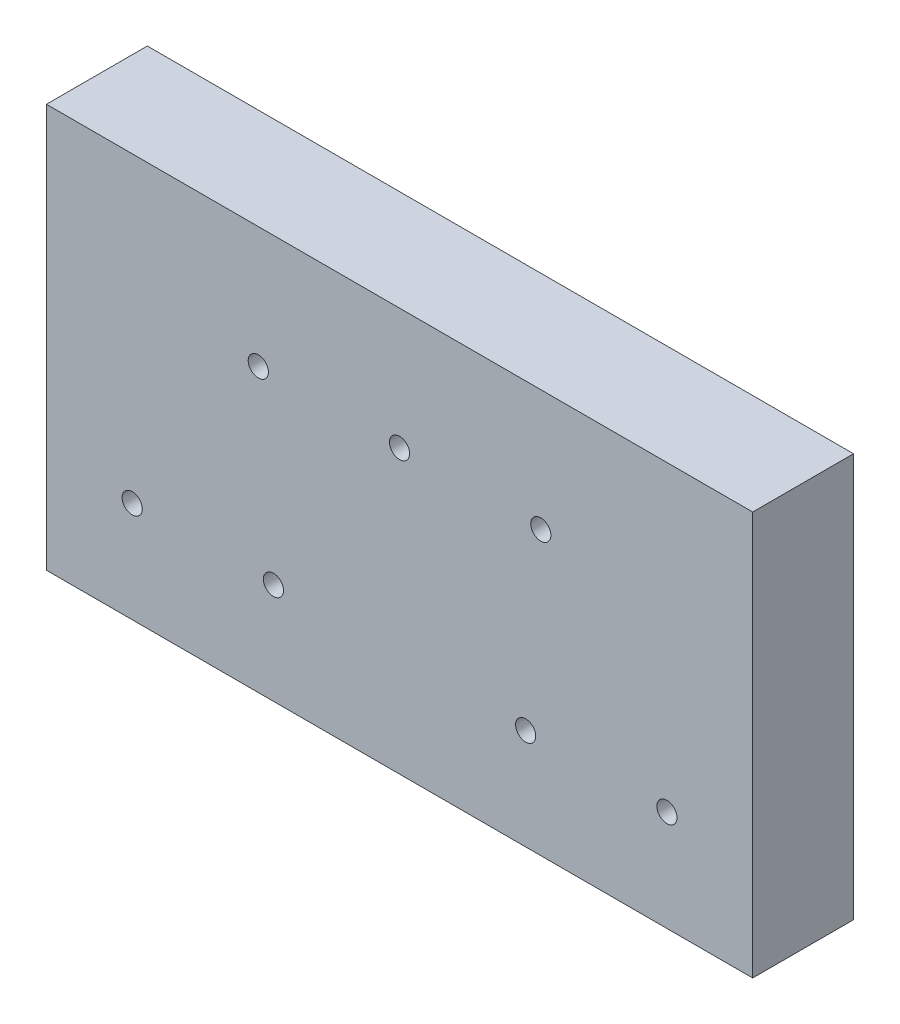
ISO-10303-21;
HEADER;
FILE_DESCRIPTION(('STEP AP214'),'2;1');
FILE_NAME('part.step','',(''),(''),'','','');
FILE_SCHEMA(('AUTOMOTIVE_DESIGN { 1 0 10303 214 1 1 1 1 }'));
ENDSEC;
DATA;
#1=APPLICATION_CONTEXT('core data for automotive mechanical design processes');
#2=APPLICATION_PROTOCOL_DEFINITION('international standard','automotive_design',2000,#1);
#3=PRODUCT_CONTEXT('',#1,'mechanical');
#4=PRODUCT('Part','Part','',(#3));
#5=PRODUCT_RELATED_PRODUCT_CATEGORY('part','',(#4));
#6=PRODUCT_DEFINITION_FORMATION('','',#4);
#7=PRODUCT_DEFINITION_CONTEXT('part definition',#1,'design');
#8=PRODUCT_DEFINITION('design','',#6,#7);
#9=PRODUCT_DEFINITION_SHAPE('','',#8);
#10=(LENGTH_UNIT() NAMED_UNIT(*) SI_UNIT(.MILLI.,.METRE.));
#11=(NAMED_UNIT(*) PLANE_ANGLE_UNIT() SI_UNIT($,.RADIAN.));
#12=(NAMED_UNIT(*) SI_UNIT($,.STERADIAN.) SOLID_ANGLE_UNIT());
#13=UNCERTAINTY_MEASURE_WITH_UNIT(LENGTH_MEASURE(1.E-05),#10,'distance_accuracy_value','');
#14=(GEOMETRIC_REPRESENTATION_CONTEXT(3) GLOBAL_UNCERTAINTY_ASSIGNED_CONTEXT((#13)) GLOBAL_UNIT_ASSIGNED_CONTEXT((#10,
#11,#12)) REPRESENTATION_CONTEXT('',''));
#15=CARTESIAN_POINT('',(0.,0.,0.));
#16=DIRECTION('',(0.,0.,1.));
#17=DIRECTION('',(1.,0.,0.));
#18=AXIS2_PLACEMENT_3D('',#15,#16,#17);
#19=CARTESIAN_POINT('',(0.,0.,10.));
#20=DIRECTION('',(0.,0.,1.));
#21=DIRECTION('',(1.,0.,0.));
#22=AXIS2_PLACEMENT_3D('',#19,#20,#21);
#23=PLANE('',#22);
#24=CARTESIAN_POINT('',(26.5,-10.,10.));
#25=DIRECTION('',(0.,0.,1.));
#26=DIRECTION('',(-1.,0.,0.));
#27=AXIS2_PLACEMENT_3D('',#24,#25,#26);
#28=CIRCLE('',#27,1.);
#29=CARTESIAN_POINT('',(25.5,-10.,10.));
#30=VERTEX_POINT('',#29);
#31=EDGE_CURVE('E139',#30,#30,#28,.T.);
#32=ORIENTED_EDGE('',*,*,#31,.F.);
#33=EDGE_LOOP('',(#32));
#34=FACE_BOUND('',#33,.T.);
#35=CARTESIAN_POINT('',(-26.5,-10.,10.));
#36=DIRECTION('',(0.,0.,1.));
#37=DIRECTION('',(1.,0.,0.));
#38=AXIS2_PLACEMENT_3D('',#35,#36,#37);
#39=CIRCLE('',#38,1.);
#40=CARTESIAN_POINT('',(-25.5,-10.,10.));
#41=VERTEX_POINT('',#40);
#42=EDGE_CURVE('E127',#41,#41,#39,.T.);
#43=ORIENTED_EDGE('',*,*,#42,.F.);
#44=EDGE_LOOP('',(#43));
#45=FACE_BOUND('',#44,.T.);
#46=CARTESIAN_POINT('',(14.,8.,10.));
#47=DIRECTION('',(0.,0.,1.));
#48=DIRECTION('',(-1.,0.,0.));
#49=AXIS2_PLACEMENT_3D('',#46,#47,#48);
#50=CIRCLE('',#49,1.);
#51=CARTESIAN_POINT('',(13.,8.,10.));
#52=VERTEX_POINT('',#51);
#53=EDGE_CURVE('E115',#52,#52,#50,.T.);
#54=ORIENTED_EDGE('',*,*,#53,.F.);
#55=EDGE_LOOP('',(#54));
#56=FACE_BOUND('',#55,.T.);
#57=DIRECTION('',(0.,-1.,0.));
#58=VECTOR('',#57,1.);
#59=CARTESIAN_POINT('',(-35.,20.,10.));
#60=LINE('',#59,#58);
#61=CARTESIAN_POINT('',(-35.,20.,10.));
#62=VERTEX_POINT('',#61);
#63=CARTESIAN_POINT('',(-35.,-20.,10.));
#64=VERTEX_POINT('',#63);
#65=EDGE_CURVE('E85',#62,#64,#60,.T.);
#66=ORIENTED_EDGE('',*,*,#65,.T.);
#67=DIRECTION('',(1.,0.,0.));
#68=VECTOR('',#67,1.);
#69=CARTESIAN_POINT('',(-35.,-20.,10.));
#70=LINE('',#69,#68);
#71=CARTESIAN_POINT('',(35.,-20.,10.));
#72=VERTEX_POINT('',#71);
#73=EDGE_CURVE('E80',#64,#72,#70,.T.);
#74=ORIENTED_EDGE('',*,*,#73,.T.);
#75=DIRECTION('',(0.,1.,0.));
#76=VECTOR('',#75,1.);
#77=CARTESIAN_POINT('',(35.,20.,10.));
#78=LINE('',#77,#76);
#79=CARTESIAN_POINT('',(35.,20.,10.));
#80=VERTEX_POINT('',#79);
#81=EDGE_CURVE('E83',#72,#80,#78,.T.);
#82=ORIENTED_EDGE('',*,*,#81,.T.);
#83=DIRECTION('',(-1.,0.,0.));
#84=VECTOR('',#83,1.);
#85=CARTESIAN_POINT('',(-35.,20.,10.));
#86=LINE('',#85,#84);
#87=EDGE_CURVE('E50',#80,#62,#86,.T.);
#88=ORIENTED_EDGE('',*,*,#87,.T.);
#89=EDGE_LOOP('',(#66,#74,#82,#88));
#90=FACE_BOUND('',#89,.T.);
#91=CARTESIAN_POINT('',(-14.,8.,10.));
#92=DIRECTION('',(0.,0.,1.));
#93=DIRECTION('',(1.,0.,0.));
#94=AXIS2_PLACEMENT_3D('',#91,#92,#93);
#95=CIRCLE('',#94,1.);
#96=CARTESIAN_POINT('',(-13.,8.,10.));
#97=VERTEX_POINT('',#96);
#98=EDGE_CURVE('E100',#97,#97,#95,.T.);
#99=ORIENTED_EDGE('',*,*,#98,.F.);
#100=EDGE_LOOP('',(#99));
#101=FACE_BOUND('',#100,.T.);
#102=CARTESIAN_POINT('',(0.,8.00000000000001,10.));
#103=DIRECTION('',(0.,0.,1.));
#104=DIRECTION('',(1.,0.,0.));
#105=AXIS2_PLACEMENT_3D('',#102,#103,#104);
#106=CIRCLE('',#105,1.);
#107=CARTESIAN_POINT('',(0.999999999999993,8.00000000000001,10.));
#108=VERTEX_POINT('',#107);
#109=EDGE_CURVE('E121',#108,#108,#106,.T.);
#110=ORIENTED_EDGE('',*,*,#109,.F.);
#111=EDGE_LOOP('',(#110));
#112=FACE_BOUND('',#111,.T.);
#113=CARTESIAN_POINT('',(-12.5,-10.,10.));
#114=DIRECTION('',(0.,0.,1.));
#115=DIRECTION('',(1.,0.,0.));
#116=AXIS2_PLACEMENT_3D('',#113,#114,#115);
#117=CIRCLE('',#116,0.999999999999999);
#118=CARTESIAN_POINT('',(-11.5,-10.,10.));
#119=VERTEX_POINT('',#118);
#120=EDGE_CURVE('E133',#119,#119,#117,.T.);
#121=ORIENTED_EDGE('',*,*,#120,.F.);
#122=EDGE_LOOP('',(#121));
#123=FACE_BOUND('',#122,.T.);
#124=CARTESIAN_POINT('',(12.5,-10.,10.));
#125=DIRECTION('',(0.,0.,1.));
#126=DIRECTION('',(-1.,0.,0.));
#127=AXIS2_PLACEMENT_3D('',#124,#125,#126);
#128=CIRCLE('',#127,0.999999999999999);
#129=CARTESIAN_POINT('',(11.5,-10.,10.));
#130=VERTEX_POINT('',#129);
#131=EDGE_CURVE('E145',#130,#130,#128,.T.);
#132=ORIENTED_EDGE('',*,*,#131,.F.);
#133=EDGE_LOOP('',(#132));
#134=FACE_BOUND('',#133,.T.);
#135=ADVANCED_FACE('F33',(#34,#45,#56,#90,#101,#112,#123,#134),#23,.T.);
#136=CARTESIAN_POINT('',(0.,0.,0.));
#137=DIRECTION('',(0.,0.,1.));
#138=DIRECTION('',(1.,0.,0.));
#139=AXIS2_PLACEMENT_3D('',#136,#137,#138);
#140=PLANE('',#139);
#141=CARTESIAN_POINT('',(26.5,-10.,0.));
#142=DIRECTION('',(0.,0.,1.));
#143=DIRECTION('',(-1.,0.,0.));
#144=AXIS2_PLACEMENT_3D('',#141,#142,#143);
#145=CIRCLE('',#144,1.);
#146=CARTESIAN_POINT('',(25.5,-10.,0.));
#147=VERTEX_POINT('',#146);
#148=EDGE_CURVE('E142',#147,#147,#145,.T.);
#149=ORIENTED_EDGE('',*,*,#148,.T.);
#150=EDGE_LOOP('',(#149));
#151=FACE_BOUND('',#150,.T.);
#152=CARTESIAN_POINT('',(-26.5,-10.,0.));
#153=DIRECTION('',(0.,0.,1.));
#154=DIRECTION('',(1.,0.,0.));
#155=AXIS2_PLACEMENT_3D('',#152,#153,#154);
#156=CIRCLE('',#155,1.);
#157=CARTESIAN_POINT('',(-25.5,-10.,0.));
#158=VERTEX_POINT('',#157);
#159=EDGE_CURVE('E130',#158,#158,#156,.T.);
#160=ORIENTED_EDGE('',*,*,#159,.T.);
#161=EDGE_LOOP('',(#160));
#162=FACE_BOUND('',#161,.T.);
#163=CARTESIAN_POINT('',(14.,8.,0.));
#164=DIRECTION('',(0.,0.,1.));
#165=DIRECTION('',(-1.,0.,0.));
#166=AXIS2_PLACEMENT_3D('',#163,#164,#165);
#167=CIRCLE('',#166,1.);
#168=CARTESIAN_POINT('',(13.,8.,0.));
#169=VERTEX_POINT('',#168);
#170=EDGE_CURVE('E118',#169,#169,#167,.T.);
#171=ORIENTED_EDGE('',*,*,#170,.T.);
#172=EDGE_LOOP('',(#171));
#173=FACE_BOUND('',#172,.T.);
#174=DIRECTION('',(0.,-1.,0.));
#175=VECTOR('',#174,1.);
#176=CARTESIAN_POINT('',(-35.,20.,0.));
#177=LINE('',#176,#175);
#178=CARTESIAN_POINT('',(-35.,20.,0.));
#179=VERTEX_POINT('',#178);
#180=CARTESIAN_POINT('',(-35.,-20.,0.));
#181=VERTEX_POINT('',#180);
#182=EDGE_CURVE('E97',#179,#181,#177,.T.);
#183=ORIENTED_EDGE('',*,*,#182,.F.);
#184=DIRECTION('',(-1.,0.,0.));
#185=VECTOR('',#184,1.);
#186=CARTESIAN_POINT('',(-35.,20.,0.));
#187=LINE('',#186,#185);
#188=CARTESIAN_POINT('',(35.,20.,0.));
#189=VERTEX_POINT('',#188);
#190=EDGE_CURVE('E73',#189,#179,#187,.T.);
#191=ORIENTED_EDGE('',*,*,#190,.F.);
#192=DIRECTION('',(0.,1.,0.));
#193=VECTOR('',#192,1.);
#194=CARTESIAN_POINT('',(35.,20.,0.));
#195=LINE('',#194,#193);
#196=CARTESIAN_POINT('',(35.,-20.,0.));
#197=VERTEX_POINT('',#196);
#198=EDGE_CURVE('E67',#197,#189,#195,.T.);
#199=ORIENTED_EDGE('',*,*,#198,.F.);
#200=DIRECTION('',(1.,0.,0.));
#201=VECTOR('',#200,1.);
#202=CARTESIAN_POINT('',(-35.,-20.,0.));
#203=LINE('',#202,#201);
#204=EDGE_CURVE('E89',#181,#197,#203,.T.);
#205=ORIENTED_EDGE('',*,*,#204,.F.);
#206=EDGE_LOOP('',(#183,#191,#199,#205));
#207=FACE_BOUND('',#206,.T.);
#208=CARTESIAN_POINT('',(-14.,8.,0.));
#209=DIRECTION('',(0.,0.,1.));
#210=DIRECTION('',(1.,0.,0.));
#211=AXIS2_PLACEMENT_3D('',#208,#209,#210);
#212=CIRCLE('',#211,1.);
#213=CARTESIAN_POINT('',(-13.,8.,0.));
#214=VERTEX_POINT('',#213);
#215=EDGE_CURVE('E112',#214,#214,#212,.T.);
#216=ORIENTED_EDGE('',*,*,#215,.T.);
#217=EDGE_LOOP('',(#216));
#218=FACE_BOUND('',#217,.T.);
#219=CARTESIAN_POINT('',(0.,8.00000000000001,0.));
#220=DIRECTION('',(0.,0.,1.));
#221=DIRECTION('',(1.,0.,0.));
#222=AXIS2_PLACEMENT_3D('',#219,#220,#221);
#223=CIRCLE('',#222,1.);
#224=CARTESIAN_POINT('',(0.999999999999993,8.00000000000001,0.));
#225=VERTEX_POINT('',#224);
#226=EDGE_CURVE('E124',#225,#225,#223,.T.);
#227=ORIENTED_EDGE('',*,*,#226,.T.);
#228=EDGE_LOOP('',(#227));
#229=FACE_BOUND('',#228,.T.);
#230=CARTESIAN_POINT('',(-12.5,-10.,0.));
#231=DIRECTION('',(0.,0.,1.));
#232=DIRECTION('',(1.,0.,0.));
#233=AXIS2_PLACEMENT_3D('',#230,#231,#232);
#234=CIRCLE('',#233,0.999999999999999);
#235=CARTESIAN_POINT('',(-11.5,-10.,0.));
#236=VERTEX_POINT('',#235);
#237=EDGE_CURVE('E136',#236,#236,#234,.T.);
#238=ORIENTED_EDGE('',*,*,#237,.T.);
#239=EDGE_LOOP('',(#238));
#240=FACE_BOUND('',#239,.T.);
#241=CARTESIAN_POINT('',(12.5,-10.,0.));
#242=DIRECTION('',(0.,0.,1.));
#243=DIRECTION('',(-1.,0.,0.));
#244=AXIS2_PLACEMENT_3D('',#241,#242,#243);
#245=CIRCLE('',#244,0.999999999999999);
#246=CARTESIAN_POINT('',(11.5,-10.,0.));
#247=VERTEX_POINT('',#246);
#248=EDGE_CURVE('E148',#247,#247,#245,.T.);
#249=ORIENTED_EDGE('',*,*,#248,.T.);
#250=EDGE_LOOP('',(#249));
#251=FACE_BOUND('',#250,.T.);
#252=ADVANCED_FACE('F108',(#151,#162,#173,#207,#218,#229,#240,#251),#140,.F.);
#253=CARTESIAN_POINT('',(-35.,20.,10.));
#254=DIRECTION('',(1.,0.,0.));
#255=DIRECTION('',(0.,1.,0.));
#256=AXIS2_PLACEMENT_3D('',#253,#254,#255);
#257=PLANE('',#256);
#258=ORIENTED_EDGE('',*,*,#182,.T.);
#259=DIRECTION('',(0.,0.,-1.));
#260=VECTOR('',#259,1.);
#261=CARTESIAN_POINT('',(-35.,-20.,10.));
#262=LINE('',#261,#260);
#263=EDGE_CURVE('E11',#64,#181,#262,.T.);
#264=ORIENTED_EDGE('',*,*,#263,.F.);
#265=ORIENTED_EDGE('',*,*,#65,.F.);
#266=DIRECTION('',(0.,0.,-1.));
#267=VECTOR('',#266,1.);
#268=CARTESIAN_POINT('',(-35.,20.,10.));
#269=LINE('',#268,#267);
#270=EDGE_CURVE('E93',#62,#179,#269,.T.);
#271=ORIENTED_EDGE('',*,*,#270,.T.);
#272=EDGE_LOOP('',(#258,#264,#265,#271));
#273=FACE_BOUND('',#272,.T.);
#274=ADVANCED_FACE('F35',(#273),#257,.F.);
#275=CARTESIAN_POINT('',(-35.,-20.,10.));
#276=DIRECTION('',(0.,1.,0.));
#277=DIRECTION('',(-1.,0.,0.));
#278=AXIS2_PLACEMENT_3D('',#275,#276,#277);
#279=PLANE('',#278);
#280=ORIENTED_EDGE('',*,*,#204,.T.);
#281=DIRECTION('',(0.,0.,-1.));
#282=VECTOR('',#281,1.);
#283=CARTESIAN_POINT('',(35.,-20.,10.));
#284=LINE('',#283,#282);
#285=EDGE_CURVE('E42',#72,#197,#284,.T.);
#286=ORIENTED_EDGE('',*,*,#285,.F.);
#287=ORIENTED_EDGE('',*,*,#73,.F.);
#288=ORIENTED_EDGE('',*,*,#263,.T.);
#289=EDGE_LOOP('',(#280,#286,#287,#288));
#290=FACE_BOUND('',#289,.T.);
#291=ADVANCED_FACE('F88',(#290),#279,.F.);
#292=CARTESIAN_POINT('',(35.,20.,10.));
#293=DIRECTION('',(-1.,0.,0.));
#294=DIRECTION('',(0.,-1.,0.));
#295=AXIS2_PLACEMENT_3D('',#292,#293,#294);
#296=PLANE('',#295);
#297=ORIENTED_EDGE('',*,*,#198,.T.);
#298=DIRECTION('',(0.,0.,-1.));
#299=VECTOR('',#298,1.);
#300=CARTESIAN_POINT('',(35.,20.,10.));
#301=LINE('',#300,#299);
#302=EDGE_CURVE('E90',#80,#189,#301,.T.);
#303=ORIENTED_EDGE('',*,*,#302,.F.);
#304=ORIENTED_EDGE('',*,*,#81,.F.);
#305=ORIENTED_EDGE('',*,*,#285,.T.);
#306=EDGE_LOOP('',(#297,#303,#304,#305));
#307=FACE_BOUND('',#306,.T.);
#308=ADVANCED_FACE('F91',(#307),#296,.F.);
#309=CARTESIAN_POINT('',(-35.,20.,10.));
#310=DIRECTION('',(0.,-1.,0.));
#311=DIRECTION('',(1.,0.,0.));
#312=AXIS2_PLACEMENT_3D('',#309,#310,#311);
#313=PLANE('',#312);
#314=ORIENTED_EDGE('',*,*,#190,.T.);
#315=ORIENTED_EDGE('',*,*,#270,.F.);
#316=ORIENTED_EDGE('',*,*,#87,.F.);
#317=ORIENTED_EDGE('',*,*,#302,.T.);
#318=EDGE_LOOP('',(#314,#315,#316,#317));
#319=FACE_BOUND('',#318,.T.);
#320=ADVANCED_FACE('F105',(#319),#313,.F.);
#321=CARTESIAN_POINT('',(-14.,8.,10.));
#322=DIRECTION('',(0.,0.,-1.));
#323=DIRECTION('',(-1.,0.,0.));
#324=AXIS2_PLACEMENT_3D('',#321,#322,#323);
#325=CYLINDRICAL_SURFACE('',#324,1.);
#326=ORIENTED_EDGE('',*,*,#98,.T.);
#327=EDGE_LOOP('',(#326));
#328=FACE_BOUND('',#327,.T.);
#329=ORIENTED_EDGE('',*,*,#215,.F.);
#330=EDGE_LOOP('',(#329));
#331=FACE_BOUND('',#330,.T.);
#332=ADVANCED_FACE('F168',(#328,#331),#325,.F.);
#333=CARTESIAN_POINT('',(14.,8.,10.));
#334=DIRECTION('',(0.,0.,-1.));
#335=DIRECTION('',(-1.,0.,0.));
#336=AXIS2_PLACEMENT_3D('',#333,#334,#335);
#337=CYLINDRICAL_SURFACE('',#336,1.);
#338=ORIENTED_EDGE('',*,*,#53,.T.);
#339=EDGE_LOOP('',(#338));
#340=FACE_BOUND('',#339,.T.);
#341=ORIENTED_EDGE('',*,*,#170,.F.);
#342=EDGE_LOOP('',(#341));
#343=FACE_BOUND('',#342,.T.);
#344=ADVANCED_FACE('F214',(#340,#343),#337,.F.);
#345=CARTESIAN_POINT('',(0.,8.00000000000001,10.));
#346=DIRECTION('',(0.,0.,-1.));
#347=DIRECTION('',(-1.,0.,0.));
#348=AXIS2_PLACEMENT_3D('',#345,#346,#347);
#349=CYLINDRICAL_SURFACE('',#348,1.);
#350=ORIENTED_EDGE('',*,*,#109,.T.);
#351=EDGE_LOOP('',(#350));
#352=FACE_BOUND('',#351,.T.);
#353=ORIENTED_EDGE('',*,*,#226,.F.);
#354=EDGE_LOOP('',(#353));
#355=FACE_BOUND('',#354,.T.);
#356=ADVANCED_FACE('F222',(#352,#355),#349,.F.);
#357=CARTESIAN_POINT('',(-26.5,-10.,10.));
#358=DIRECTION('',(0.,0.,-1.));
#359=DIRECTION('',(-1.,0.,0.));
#360=AXIS2_PLACEMENT_3D('',#357,#358,#359);
#361=CYLINDRICAL_SURFACE('',#360,1.);
#362=ORIENTED_EDGE('',*,*,#42,.T.);
#363=EDGE_LOOP('',(#362));
#364=FACE_BOUND('',#363,.T.);
#365=ORIENTED_EDGE('',*,*,#159,.F.);
#366=EDGE_LOOP('',(#365));
#367=FACE_BOUND('',#366,.T.);
#368=ADVANCED_FACE('F230',(#364,#367),#361,.F.);
#369=CARTESIAN_POINT('',(-12.5,-10.,10.));
#370=DIRECTION('',(0.,0.,-1.));
#371=DIRECTION('',(-1.,0.,0.));
#372=AXIS2_PLACEMENT_3D('',#369,#370,#371);
#373=CYLINDRICAL_SURFACE('',#372,0.999999999999999);
#374=ORIENTED_EDGE('',*,*,#120,.T.);
#375=EDGE_LOOP('',(#374));
#376=FACE_BOUND('',#375,.T.);
#377=ORIENTED_EDGE('',*,*,#237,.F.);
#378=EDGE_LOOP('',(#377));
#379=FACE_BOUND('',#378,.T.);
#380=ADVANCED_FACE('F239',(#376,#379),#373,.F.);
#381=CARTESIAN_POINT('',(26.5,-10.,10.));
#382=DIRECTION('',(0.,0.,-1.));
#383=DIRECTION('',(-1.,0.,0.));
#384=AXIS2_PLACEMENT_3D('',#381,#382,#383);
#385=CYLINDRICAL_SURFACE('',#384,1.);
#386=ORIENTED_EDGE('',*,*,#31,.T.);
#387=EDGE_LOOP('',(#386));
#388=FACE_BOUND('',#387,.T.);
#389=ORIENTED_EDGE('',*,*,#148,.F.);
#390=EDGE_LOOP('',(#389));
#391=FACE_BOUND('',#390,.T.);
#392=ADVANCED_FACE('F248',(#388,#391),#385,.F.);
#393=CARTESIAN_POINT('',(12.5,-10.,10.));
#394=DIRECTION('',(0.,0.,-1.));
#395=DIRECTION('',(-1.,0.,0.));
#396=AXIS2_PLACEMENT_3D('',#393,#394,#395);
#397=CYLINDRICAL_SURFACE('',#396,0.999999999999999);
#398=ORIENTED_EDGE('',*,*,#131,.T.);
#399=EDGE_LOOP('',(#398));
#400=FACE_BOUND('',#399,.T.);
#401=ORIENTED_EDGE('',*,*,#248,.F.);
#402=EDGE_LOOP('',(#401));
#403=FACE_BOUND('',#402,.T.);
#404=ADVANCED_FACE('F154',(#400,#403),#397,.F.);
#405=CLOSED_SHELL('',(#135,#252,#274,#291,#308,#320,#332,#344,#356,#368,#380,#392,#404));
#406=MANIFOLD_SOLID_BREP('B2',#405);
#407=ADVANCED_BREP_SHAPE_REPRESENTATION('',(#18,#406),#14);
#408=SHAPE_DEFINITION_REPRESENTATION(#9,#407);
ENDSEC;
END-ISO-10303-21;
